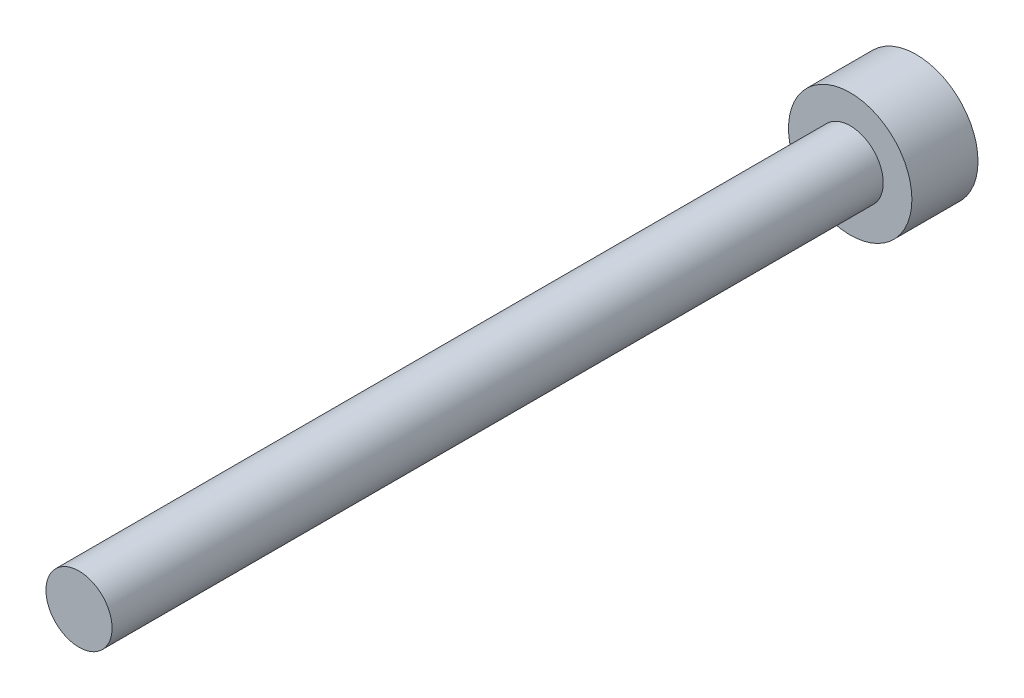
ISO-10303-21;
HEADER;
FILE_DESCRIPTION(('STEP AP214'),'2;1');
FILE_NAME('part.step','',(''),(''),'','','');
FILE_SCHEMA(('AUTOMOTIVE_DESIGN { 1 0 10303 214 1 1 1 1 }'));
ENDSEC;
DATA;
#1=APPLICATION_CONTEXT('core data for automotive mechanical design processes');
#2=APPLICATION_PROTOCOL_DEFINITION('international standard','automotive_design',2000,#1);
#3=PRODUCT_CONTEXT('',#1,'mechanical');
#4=PRODUCT('Part','Part','',(#3));
#5=PRODUCT_RELATED_PRODUCT_CATEGORY('part','',(#4));
#6=PRODUCT_DEFINITION_FORMATION('','',#4);
#7=PRODUCT_DEFINITION_CONTEXT('part definition',#1,'design');
#8=PRODUCT_DEFINITION('design','',#6,#7);
#9=PRODUCT_DEFINITION_SHAPE('','',#8);
#10=(LENGTH_UNIT() NAMED_UNIT(*) SI_UNIT(.MILLI.,.METRE.));
#11=(NAMED_UNIT(*) PLANE_ANGLE_UNIT() SI_UNIT($,.RADIAN.));
#12=(NAMED_UNIT(*) SI_UNIT($,.STERADIAN.) SOLID_ANGLE_UNIT());
#13=UNCERTAINTY_MEASURE_WITH_UNIT(LENGTH_MEASURE(1.E-05),#10,'distance_accuracy_value','');
#14=(GEOMETRIC_REPRESENTATION_CONTEXT(3) GLOBAL_UNCERTAINTY_ASSIGNED_CONTEXT((#13)) GLOBAL_UNIT_ASSIGNED_CONTEXT((#10,
#11,#12)) REPRESENTATION_CONTEXT('',''));
#15=CARTESIAN_POINT('',(0.,0.,0.));
#16=DIRECTION('',(0.,0.,1.));
#17=DIRECTION('',(1.,0.,0.));
#18=AXIS2_PLACEMENT_3D('',#15,#16,#17);
#19=CARTESIAN_POINT('',(0.,0.,3.));
#20=DIRECTION('',(0.,0.,-1.));
#21=DIRECTION('',(-1.,0.,0.));
#22=AXIS2_PLACEMENT_3D('',#19,#20,#21);
#23=CYLINDRICAL_SURFACE('',#22,2.8);
#24=CARTESIAN_POINT('',(0.,0.,3.));
#25=DIRECTION('',(0.,0.,1.));
#26=DIRECTION('',(1.,0.,0.));
#27=AXIS2_PLACEMENT_3D('',#24,#25,#26);
#28=CIRCLE('',#27,2.8);
#29=CARTESIAN_POINT('',(2.8,0.,3.));
#30=VERTEX_POINT('',#29);
#31=EDGE_CURVE('E43',#30,#30,#28,.T.);
#32=ORIENTED_EDGE('',*,*,#31,.F.);
#33=EDGE_LOOP('',(#32));
#34=FACE_BOUND('',#33,.T.);
#35=CARTESIAN_POINT('',(0.,0.,0.));
#36=DIRECTION('',(0.,0.,1.));
#37=DIRECTION('',(1.,0.,0.));
#38=AXIS2_PLACEMENT_3D('',#35,#36,#37);
#39=CIRCLE('',#38,2.8);
#40=CARTESIAN_POINT('',(2.8,0.,0.));
#41=VERTEX_POINT('',#40);
#42=EDGE_CURVE('E39',#41,#41,#39,.T.);
#43=ORIENTED_EDGE('',*,*,#42,.T.);
#44=EDGE_LOOP('',(#43));
#45=FACE_BOUND('',#44,.T.);
#46=ADVANCED_FACE('F36',(#34,#45),#23,.T.);
#47=CARTESIAN_POINT('',(0.,0.,3.));
#48=DIRECTION('',(0.,0.,1.));
#49=DIRECTION('',(1.,0.,0.));
#50=AXIS2_PLACEMENT_3D('',#47,#48,#49);
#51=PLANE('',#50);
#52=CARTESIAN_POINT('',(0.,0.,3.));
#53=DIRECTION('',(0.,0.,1.));
#54=DIRECTION('',(1.,0.,0.));
#55=AXIS2_PLACEMENT_3D('',#52,#53,#54);
#56=CIRCLE('',#55,1.5);
#57=CARTESIAN_POINT('',(1.5,0.,3.));
#58=VERTEX_POINT('',#57);
#59=EDGE_CURVE('E10',#58,#58,#56,.T.);
#60=ORIENTED_EDGE('',*,*,#59,.F.);
#61=EDGE_LOOP('',(#60));
#62=FACE_BOUND('',#61,.T.);
#63=ORIENTED_EDGE('',*,*,#31,.T.);
#64=EDGE_LOOP('',(#63));
#65=FACE_BOUND('',#64,.T.);
#66=ADVANCED_FACE('F60',(#62,#65),#51,.T.);
#67=CARTESIAN_POINT('',(0.,0.,0.));
#68=DIRECTION('',(0.,0.,1.));
#69=DIRECTION('',(1.,0.,0.));
#70=AXIS2_PLACEMENT_3D('',#67,#68,#69);
#71=PLANE('',#70);
#72=ORIENTED_EDGE('',*,*,#42,.F.);
#73=EDGE_LOOP('',(#72));
#74=FACE_BOUND('',#73,.T.);
#75=ADVANCED_FACE('F57',(#74),#71,.F.);
#76=CARTESIAN_POINT('',(0.,0.,38.));
#77=DIRECTION('',(0.,0.,-1.));
#78=DIRECTION('',(-1.,0.,0.));
#79=AXIS2_PLACEMENT_3D('',#76,#77,#78);
#80=CYLINDRICAL_SURFACE('',#79,1.5);
#81=CARTESIAN_POINT('',(0.,0.,38.));
#82=DIRECTION('',(0.,0.,1.));
#83=DIRECTION('',(1.,0.,0.));
#84=AXIS2_PLACEMENT_3D('',#81,#82,#83);
#85=CIRCLE('',#84,1.5);
#86=CARTESIAN_POINT('',(1.5,0.,38.));
#87=VERTEX_POINT('',#86);
#88=EDGE_CURVE('E49',#87,#87,#85,.T.);
#89=ORIENTED_EDGE('',*,*,#88,.F.);
#90=EDGE_LOOP('',(#89));
#91=FACE_BOUND('',#90,.T.);
#92=ORIENTED_EDGE('',*,*,#59,.T.);
#93=EDGE_LOOP('',(#92));
#94=FACE_BOUND('',#93,.T.);
#95=ADVANCED_FACE('F59',(#91,#94),#80,.T.);
#96=CARTESIAN_POINT('',(0.,0.,38.));
#97=DIRECTION('',(0.,0.,1.));
#98=DIRECTION('',(1.,0.,0.));
#99=AXIS2_PLACEMENT_3D('',#96,#97,#98);
#100=PLANE('',#99);
#101=ORIENTED_EDGE('',*,*,#88,.T.);
#102=EDGE_LOOP('',(#101));
#103=FACE_BOUND('',#102,.T.);
#104=ADVANCED_FACE('F65',(#103),#100,.T.);
#105=CLOSED_SHELL('',(#46,#66,#75,#95,#104));
#106=MANIFOLD_SOLID_BREP('B2',#105);
#107=ADVANCED_BREP_SHAPE_REPRESENTATION('',(#18,#106),#14);
#108=SHAPE_DEFINITION_REPRESENTATION(#9,#107);
ENDSEC;
END-ISO-10303-21;
